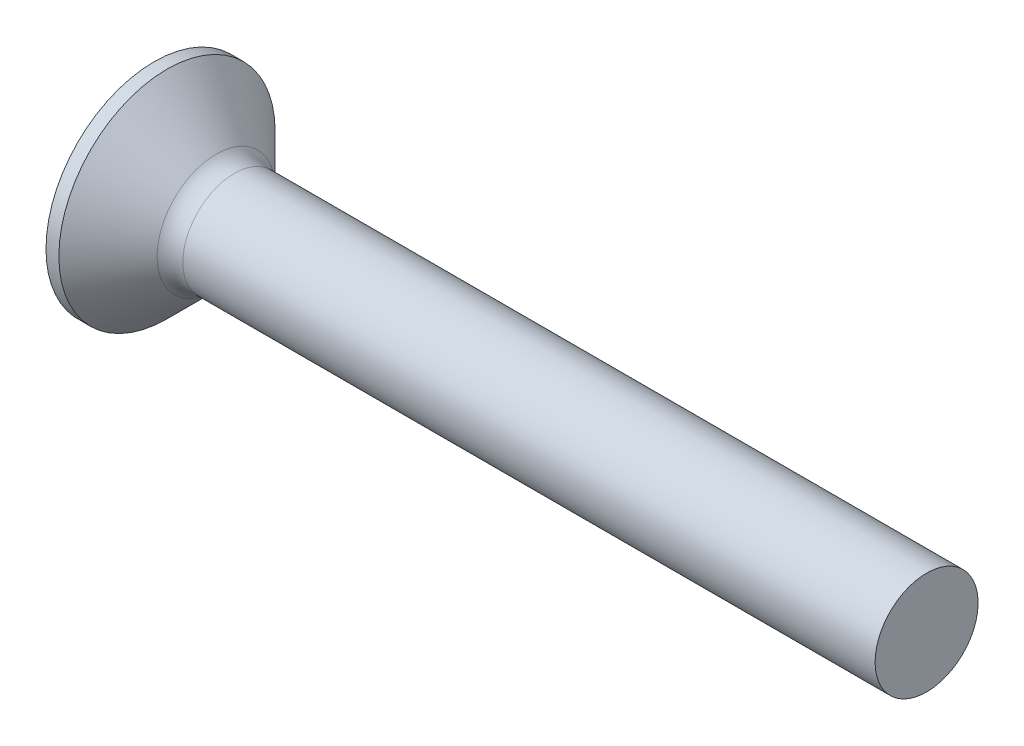
ISO-10303-21;
HEADER;
FILE_DESCRIPTION(('STEP AP214'),'2;1');
FILE_NAME('part.step','',(''),(''),'','','');
FILE_SCHEMA(('AUTOMOTIVE_DESIGN { 1 0 10303 214 1 1 1 1 }'));
ENDSEC;
DATA;
#1=APPLICATION_CONTEXT('core data for automotive mechanical design processes');
#2=APPLICATION_PROTOCOL_DEFINITION('international standard','automotive_design',2000,#1);
#3=PRODUCT_CONTEXT('',#1,'mechanical');
#4=PRODUCT('Part','Part','',(#3));
#5=PRODUCT_RELATED_PRODUCT_CATEGORY('part','',(#4));
#6=PRODUCT_DEFINITION_FORMATION('','',#4);
#7=PRODUCT_DEFINITION_CONTEXT('part definition',#1,'design');
#8=PRODUCT_DEFINITION('design','',#6,#7);
#9=PRODUCT_DEFINITION_SHAPE('','',#8);
#10=(LENGTH_UNIT() NAMED_UNIT(*) SI_UNIT(.MILLI.,.METRE.));
#11=(NAMED_UNIT(*) PLANE_ANGLE_UNIT() SI_UNIT($,.RADIAN.));
#12=(NAMED_UNIT(*) SI_UNIT($,.STERADIAN.) SOLID_ANGLE_UNIT());
#13=UNCERTAINTY_MEASURE_WITH_UNIT(LENGTH_MEASURE(1.E-05),#10,'distance_accuracy_value','');
#14=(GEOMETRIC_REPRESENTATION_CONTEXT(3) GLOBAL_UNCERTAINTY_ASSIGNED_CONTEXT((#13)) GLOBAL_UNIT_ASSIGNED_CONTEXT((#10,
#11,#12)) REPRESENTATION_CONTEXT('',''));
#15=CARTESIAN_POINT('',(0.,0.,0.));
#16=DIRECTION('',(0.,0.,1.));
#17=DIRECTION('',(1.,0.,0.));
#18=AXIS2_PLACEMENT_3D('',#15,#16,#17);
#19=CARTESIAN_POINT('',(9.32000000000001,0.,0.));
#20=DIRECTION('',(-1.,0.,0.));
#21=DIRECTION('',(0.,-1.,0.));
#22=AXIS2_PLACEMENT_3D('',#19,#20,#21);
#23=SPHERICAL_SURFACE('',#22,9.32000000000001);
#24=CARTESIAN_POINT('',(1.,0.,0.));
#25=DIRECTION('',(-1.,0.,0.));
#26=DIRECTION('',(0.,0.,1.));
#27=AXIS2_PLACEMENT_3D('',#24,#25,#26);
#28=CIRCLE('',#27,4.2);
#29=CARTESIAN_POINT('',(1.,0.,4.2));
#30=VERTEX_POINT('',#29);
#31=EDGE_CURVE('E211',#30,#30,#28,.T.);
#32=ORIENTED_EDGE('',*,*,#31,.T.);
#33=EDGE_LOOP('',(#32));
#34=FACE_BOUND('',#33,.T.);
#35=CARTESIAN_POINT('',(9.32000000000001,0.515,0.));
#36=DIRECTION('',(0.,-1.,0.));
#37=DIRECTION('',(0.,0.,-1.));
#38=AXIS2_PLACEMENT_3D('',#35,#36,#37);
#39=CIRCLE('',#38,9.3057603128385);
#40=CARTESIAN_POINT('',(0.31412764238453,0.515000000000008,-2.34338176111737));
#41=VERTEX_POINT('',#40);
#42=CARTESIAN_POINT('',(0.0608783606675722,0.515000000000003,-0.930506027947122));
#43=VERTEX_POINT('',#42);
#44=EDGE_CURVE('E292',#41,#43,#39,.F.);
#45=ORIENTED_EDGE('',*,*,#44,.T.);
#46=CARTESIAN_POINT('',(0.0608783606675708,0.,0.));
#47=DIRECTION('',(1.,0.,0.));
#48=DIRECTION('',(0.,0.,-1.));
#49=AXIS2_PLACEMENT_3D('',#46,#47,#48);
#50=CIRCLE('',#49,1.06351608734703);
#51=CARTESIAN_POINT('',(0.0608783606675708,0.930506027947123,-0.515));
#52=VERTEX_POINT('',#51);
#53=EDGE_CURVE('E321',#43,#52,#50,.T.);
#54=ORIENTED_EDGE('',*,*,#53,.T.);
#55=CARTESIAN_POINT('',(9.32000000000001,0.,-0.515));
#56=DIRECTION('',(0.,0.,1.));
#57=DIRECTION('',(1.,0.,0.));
#58=AXIS2_PLACEMENT_3D('',#55,#56,#57);
#59=CIRCLE('',#58,9.3057603128385);
#60=CARTESIAN_POINT('',(0.314127642384539,2.3433817611174,-0.515));
#61=VERTEX_POINT('',#60);
#62=EDGE_CURVE('E233',#52,#61,#59,.F.);
#63=ORIENTED_EDGE('',*,*,#62,.T.);
#64=CARTESIAN_POINT('',(8.4627527920284,-1.71937218999577,0.));
#65=DIRECTION('',(0.446197753347395,0.894934391398463,0.));
#66=DIRECTION('',(-0.894934391398463,0.446197753347395,0.));
#67=AXIS2_PLACEMENT_3D('',#64,#65,#66);
#68=CIRCLE('',#67,9.11982930194936);
#69=CARTESIAN_POINT('',(0.314127642384539,2.34338176111741,0.515));
#70=VERTEX_POINT('',#69);
#71=EDGE_CURVE('E237',#70,#61,#68,.F.);
#72=ORIENTED_EDGE('',*,*,#71,.F.);
#73=CARTESIAN_POINT('',(9.32000000000001,0.,0.515));
#74=DIRECTION('',(0.,0.,-1.));
#75=DIRECTION('',(0.,1.,0.));
#76=AXIS2_PLACEMENT_3D('',#73,#74,#75);
#77=CIRCLE('',#76,9.3057603128385);
#78=CARTESIAN_POINT('',(0.0608783606675708,0.930506027947123,0.515));
#79=VERTEX_POINT('',#78);
#80=EDGE_CURVE('E230',#70,#79,#77,.F.);
#81=ORIENTED_EDGE('',*,*,#80,.T.);
#82=CARTESIAN_POINT('',(0.0608783606675726,0.514999999999997,0.930506027947125));
#83=VERTEX_POINT('',#82);
#84=EDGE_CURVE('E347',#79,#83,#50,.T.);
#85=ORIENTED_EDGE('',*,*,#84,.T.);
#86=CARTESIAN_POINT('',(0.314127642384539,0.514999999999992,2.34338176111741));
#87=VERTEX_POINT('',#86);
#88=EDGE_CURVE('E258',#83,#87,#39,.F.);
#89=ORIENTED_EDGE('',*,*,#88,.T.);
#90=CARTESIAN_POINT('',(8.4627527920284,0.,-1.71937218999577));
#91=DIRECTION('',(0.446197753347395,0.,0.894934391398463));
#92=DIRECTION('',(0.894934391398463,0.,-0.446197753347395));
#93=AXIS2_PLACEMENT_3D('',#90,#91,#92);
#94=CIRCLE('',#93,9.11982930194936);
#95=CARTESIAN_POINT('',(0.314127642384539,-0.515000000000009,2.3433817611174));
#96=VERTEX_POINT('',#95);
#97=EDGE_CURVE('E55',#96,#87,#94,.F.);
#98=ORIENTED_EDGE('',*,*,#97,.F.);
#99=CARTESIAN_POINT('',(9.32000000000001,-0.515,0.));
#100=DIRECTION('',(0.,1.,0.));
#101=DIRECTION('',(0.,0.,1.));
#102=AXIS2_PLACEMENT_3D('',#99,#100,#101);
#103=CIRCLE('',#102,9.3057603128385);
#104=CARTESIAN_POINT('',(0.0608783606675712,-0.515000000000003,0.930506027947122));
#105=VERTEX_POINT('',#104);
#106=EDGE_CURVE('E261',#96,#105,#103,.F.);
#107=ORIENTED_EDGE('',*,*,#106,.T.);
#108=CARTESIAN_POINT('',(0.0608783606675708,-0.930506027947123,0.515));
#109=VERTEX_POINT('',#108);
#110=EDGE_CURVE('E382',#105,#109,#50,.T.);
#111=ORIENTED_EDGE('',*,*,#110,.T.);
#112=CARTESIAN_POINT('',(0.31412764238453,-2.34338176111737,0.514999999999999));
#113=VERTEX_POINT('',#112);
#114=EDGE_CURVE('E229',#109,#113,#77,.F.);
#115=ORIENTED_EDGE('',*,*,#114,.T.);
#116=CARTESIAN_POINT('',(8.46275279202785,1.71937218999647,0.));
#117=DIRECTION('',(0.446197753347477,-0.894934391398422,0.));
#118=DIRECTION('',(0.894934391398422,0.446197753347477,0.));
#119=AXIS2_PLACEMENT_3D('',#116,#117,#118);
#120=CIRCLE('',#119,9.11982930194918);
#121=CARTESIAN_POINT('',(0.31412764238453,-2.34338176111737,-0.515));
#122=VERTEX_POINT('',#121);
#123=EDGE_CURVE('E227',#122,#113,#120,.F.);
#124=ORIENTED_EDGE('',*,*,#123,.F.);
#125=CARTESIAN_POINT('',(0.0608783606675708,-0.930506027947123,-0.515));
#126=VERTEX_POINT('',#125);
#127=EDGE_CURVE('E234',#122,#126,#59,.F.);
#128=ORIENTED_EDGE('',*,*,#127,.T.);
#129=CARTESIAN_POINT('',(0.0608783606675709,-0.514999999999996,-0.930506027947126));
#130=VERTEX_POINT('',#129);
#131=EDGE_CURVE('E342',#126,#130,#50,.T.);
#132=ORIENTED_EDGE('',*,*,#131,.T.);
#133=CARTESIAN_POINT('',(0.31412764238453,-0.514999999999991,-2.34338176111737));
#134=VERTEX_POINT('',#133);
#135=EDGE_CURVE('E263',#130,#134,#103,.F.);
#136=ORIENTED_EDGE('',*,*,#135,.T.);
#137=CARTESIAN_POINT('',(8.46275279202785,0.,1.71937218999647));
#138=DIRECTION('',(0.446197753347477,0.,-0.894934391398422));
#139=DIRECTION('',(-0.894934391398422,0.,-0.446197753347477));
#140=AXIS2_PLACEMENT_3D('',#137,#138,#139);
#141=CIRCLE('',#140,9.11982930194918);
#142=EDGE_CURVE('E240',#41,#134,#141,.F.);
#143=ORIENTED_EDGE('',*,*,#142,.F.);
#144=EDGE_LOOP('',(#45,#54,#63,#72,#81,#85,#89,#98,#107,#111,#115,#124,#128,#132,#136,#143));
#145=FACE_BOUND('',#144,.T.);
#146=ADVANCED_FACE('F41',(#34,#145),#23,.T.);
#147=CARTESIAN_POINT('',(3.1,0.954397273508,-0.515));
#148=DIRECTION('',(0.,0.,1.));
#149=DIRECTION('',(1.,0.,0.));
#150=AXIS2_PLACEMENT_3D('',#147,#148,#149);
#151=PLANE('',#150);
#152=ORIENTED_EDGE('',*,*,#62,.F.);
#153=CARTESIAN_POINT('',(-1.51350935868061,1.05457609529703,-0.515));
#154=CARTESIAN_POINT('',(-1.19095756898956,1.02946929695738,-0.515));
#155=CARTESIAN_POINT('',(-0.868418100655429,1.00420218778782,-0.515));
#156=CARTESIAN_POINT('',(-0.223370410701535,0.953235962920824,-0.515));
#157=CARTESIAN_POINT('',(0.0991378106119195,0.927536843349418,-0.515));
#158=CARTESIAN_POINT('',(0.744110602564964,0.875595660283787,-0.515));
#159=CARTESIAN_POINT('',(1.06657517320614,0.849353596809247,-0.515));
#160=CARTESIAN_POINT('',(1.71144366881838,0.796155443949035,-0.515));
#161=CARTESIAN_POINT('',(2.03384759413785,0.769199358799847,-0.515));
#162=CARTESIAN_POINT('',(2.59585161484893,0.721356774291739,-0.515));
#163=CARTESIAN_POINT('',(2.83547018368547,0.700687775889178,-0.515));
#164=CARTESIAN_POINT('',(3.31464494543874,0.658646734801249,-0.515));
#165=CARTESIAN_POINT('',(3.55420113855084,0.637274694345303,-0.515));
#166=CARTESIAN_POINT('',(4.0332358507464,0.593604611178465,-0.515));
#167=CARTESIAN_POINT('',(4.27271436777158,0.571306545674765,-0.515));
#168=CARTESIAN_POINT('',(4.75154290591158,0.525345817751328,-0.515));
#169=CARTESIAN_POINT('',(4.99089292544568,0.501683138916145,-0.515));
#170=CARTESIAN_POINT('',(5.23015335451577,0.477118870369912,-0.515));
#171=B_SPLINE_CURVE_WITH_KNOTS('',3,(#153,#154,#155,#156,#157,#158,#159,#160,#161,#162,#163,
#164,#165,#166,#167,#168,#169,#170),.UNSPECIFIED.,.F.,.F.,(4,2,2,2,2,2,2,2,4),(0.,
0.970582535235106,1.94117377862305,2.91176498682315,3.88235043753319,4.60387465387786,
5.32539658241397,6.04693628073922,6.76848466054722),.UNSPECIFIED.);
#172=CARTESIAN_POINT('',(3.1,0.677477674908922,-0.514999999999999));
#173=VERTEX_POINT('',#172);
#174=EDGE_CURVE('E369',#52,#173,#171,.T.);
#175=ORIENTED_EDGE('',*,*,#174,.T.);
#176=DIRECTION('',(0.,1.,0.));
#177=VECTOR('',#176,1.);
#178=CARTESIAN_POINT('',(3.1,-0.954397273507643,-0.515));
#179=LINE('',#178,#177);
#180=CARTESIAN_POINT('',(3.1,0.954397273508,-0.515));
#181=VERTEX_POINT('',#180);
#182=EDGE_CURVE('E312',#173,#181,#179,.T.);
#183=ORIENTED_EDGE('',*,*,#182,.T.);
#184=DIRECTION('',(0.894934391398463,-0.446197753347395,0.));
#185=VECTOR('',#184,1.);
#186=CARTESIAN_POINT('',(0.,2.5,-0.515));
#187=LINE('',#186,#185);
#188=EDGE_CURVE('E208',#61,#181,#187,.T.);
#189=ORIENTED_EDGE('',*,*,#188,.F.);
#190=EDGE_LOOP('',(#152,#175,#183,#189));
#191=FACE_BOUND('',#190,.T.);
#192=ADVANCED_FACE('F176',(#191),#151,.T.);
#193=CARTESIAN_POINT('',(3.1,-0.954397273507643,-0.515));
#194=VERTEX_POINT('',#193);
#195=CARTESIAN_POINT('',(3.1,-0.677477674908922,-0.514999999999999));
#196=VERTEX_POINT('',#195);
#197=EDGE_CURVE('E217',#194,#196,#179,.T.);
#198=ORIENTED_EDGE('',*,*,#197,.T.);
#199=CARTESIAN_POINT('',(-1.51350935868061,-1.05457609529703,-0.515));
#200=CARTESIAN_POINT('',(-1.19095756898956,-1.02946929695738,-0.515));
#201=CARTESIAN_POINT('',(-0.868418100655429,-1.00420218778782,-0.515));
#202=CARTESIAN_POINT('',(-0.223370410701535,-0.953235962920824,-0.515));
#203=CARTESIAN_POINT('',(0.0991378106119193,-0.927536843349418,-0.515));
#204=CARTESIAN_POINT('',(0.744110602564964,-0.875595660283787,-0.515));
#205=CARTESIAN_POINT('',(1.06657517320614,-0.849353596809247,-0.515));
#206=CARTESIAN_POINT('',(1.71144366881838,-0.796155443949035,-0.515));
#207=CARTESIAN_POINT('',(2.03384759413785,-0.769199358799847,-0.515));
#208=CARTESIAN_POINT('',(2.59585161484893,-0.721356774291739,-0.515));
#209=CARTESIAN_POINT('',(2.83547018368547,-0.700687775889178,-0.515));
#210=CARTESIAN_POINT('',(3.31464494543874,-0.658646734801249,-0.515));
#211=CARTESIAN_POINT('',(3.55420113855084,-0.637274694345303,-0.515));
#212=CARTESIAN_POINT('',(4.0332358507464,-0.593604611178465,-0.515));
#213=CARTESIAN_POINT('',(4.27271436777159,-0.571306545674765,-0.515));
#214=CARTESIAN_POINT('',(4.75154290591158,-0.525345817751327,-0.515));
#215=CARTESIAN_POINT('',(4.99089292544568,-0.501683138916145,-0.515));
#216=CARTESIAN_POINT('',(5.23015335451577,-0.477118870369912,-0.515));
#217=B_SPLINE_CURVE_WITH_KNOTS('',3,(#199,#200,#201,#202,#203,#204,#205,#206,#207,#208,#209,
#210,#211,#212,#213,#214,#215,#216),.UNSPECIFIED.,.F.,.F.,(4,2,2,2,2,2,2,2,4),(0.,
0.970582535235105,1.94117377862305,2.91176498682315,3.88235043753319,4.60387465387786,
5.32539658241397,6.04693628073923,6.76848466054722),.UNSPECIFIED.);
#218=EDGE_CURVE('E346',#196,#126,#217,.F.);
#219=ORIENTED_EDGE('',*,*,#218,.T.);
#220=ORIENTED_EDGE('',*,*,#127,.F.);
#221=DIRECTION('',(0.894934391398422,0.446197753347477,0.));
#222=VECTOR('',#221,1.);
#223=CARTESIAN_POINT('',(0.,-2.5,-0.515));
#224=LINE('',#223,#222);
#225=EDGE_CURVE('E70',#122,#194,#224,.T.);
#226=ORIENTED_EDGE('',*,*,#225,.T.);
#227=EDGE_LOOP('',(#198,#219,#220,#226));
#228=FACE_BOUND('',#227,.T.);
#229=ADVANCED_FACE('F182',(#228),#151,.T.);
#230=CARTESIAN_POINT('',(3.1,-0.954397273507643,0.515));
#231=DIRECTION('',(0.,0.,-1.));
#232=DIRECTION('',(0.,1.,0.));
#233=AXIS2_PLACEMENT_3D('',#230,#231,#232);
#234=PLANE('',#233);
#235=DIRECTION('',(0.,-1.,0.));
#236=VECTOR('',#235,1.);
#237=CARTESIAN_POINT('',(3.1,0.954397273508,0.515));
#238=LINE('',#237,#236);
#239=CARTESIAN_POINT('',(3.1,0.954397273508,0.515));
#240=VERTEX_POINT('',#239);
#241=CARTESIAN_POINT('',(3.1,0.677477674908922,0.514999999999999));
#242=VERTEX_POINT('',#241);
#243=EDGE_CURVE('E302',#240,#242,#238,.T.);
#244=ORIENTED_EDGE('',*,*,#243,.T.);
#245=CARTESIAN_POINT('',(-1.51350936111664,1.0545760954866,0.515));
#246=CARTESIAN_POINT('',(-1.19095757112503,1.02946929712442,0.515));
#247=CARTESIAN_POINT('',(-0.868418102490364,1.00420218793212,0.515));
#248=CARTESIAN_POINT('',(-0.223370411935421,0.953235963019012,0.515));
#249=CARTESIAN_POINT('',(0.09913780967854,0.927536843424223,0.515));
#250=CARTESIAN_POINT('',(0.744110602455237,0.875595660292984,0.515));
#251=CARTESIAN_POINT('',(1.06657517361953,0.849353596775842,0.515));
#252=CARTESIAN_POINT('',(1.71144367027778,0.796155443827942,0.515));
#253=CARTESIAN_POINT('',(2.03384759612015,0.769199358633667,0.515));
#254=CARTESIAN_POINT('',(2.59585161735382,0.721356774076593,0.515));
#255=CARTESIAN_POINT('',(2.83547018619018,0.70068777567191,0.515));
#256=CARTESIAN_POINT('',(3.31464494794304,0.658646734579058,0.515));
#257=CARTESIAN_POINT('',(3.5542011410549,0.637274694120309,0.515));
#258=CARTESIAN_POINT('',(4.0332358532499,0.593604610946871,0.515));
#259=CARTESIAN_POINT('',(4.27271437027475,0.571306545439374,0.515));
#260=CARTESIAN_POINT('',(4.7515429084139,0.525345817506525,0.515));
#261=CARTESIAN_POINT('',(4.99089292794747,0.50168313866573,0.515));
#262=CARTESIAN_POINT('',(5.23015335701689,0.477118870112566,0.515));
#263=B_SPLINE_CURVE_WITH_KNOTS('',3,(#245,#246,#247,#248,#249,#250,#251,#252,#253,#254,#255,
#256,#257,#258,#259,#260,#261,#262),.UNSPECIFIED.,.F.,.F.,(4,2,2,2,2,2,2,2,4),(0.,
0.970582536139303,1.94117378043149,2.91176499020614,3.88235044249068,4.60387465883538,
5.32539658737152,6.04693628569685,6.76848466550493),.UNSPECIFIED.);
#264=EDGE_CURVE('E268',#242,#79,#263,.F.);
#265=ORIENTED_EDGE('',*,*,#264,.T.);
#266=ORIENTED_EDGE('',*,*,#80,.F.);
#267=DIRECTION('',(0.894934391398463,-0.446197753347395,0.));
#268=VECTOR('',#267,1.);
#269=CARTESIAN_POINT('',(0.,2.5,0.515));
#270=LINE('',#269,#268);
#271=EDGE_CURVE('E214',#70,#240,#270,.T.);
#272=ORIENTED_EDGE('',*,*,#271,.T.);
#273=EDGE_LOOP('',(#244,#265,#266,#272));
#274=FACE_BOUND('',#273,.T.);
#275=ADVANCED_FACE('F365',(#274),#234,.T.);
#276=ORIENTED_EDGE('',*,*,#114,.F.);
#277=CARTESIAN_POINT('',(-1.51350936111664,-1.0545760954866,0.515));
#278=CARTESIAN_POINT('',(-1.19095757112503,-1.02946929712442,0.515));
#279=CARTESIAN_POINT('',(-0.868418102490364,-1.00420218793212,0.515));
#280=CARTESIAN_POINT('',(-0.223370411935421,-0.953235963019012,0.515));
#281=CARTESIAN_POINT('',(0.0991378096785398,-0.927536843424223,0.515));
#282=CARTESIAN_POINT('',(0.744110602455238,-0.875595660292984,0.515));
#283=CARTESIAN_POINT('',(1.06657517361953,-0.849353596775842,0.515));
#284=CARTESIAN_POINT('',(1.71144367027778,-0.796155443827942,0.515));
#285=CARTESIAN_POINT('',(2.03384759612015,-0.769199358633667,0.515));
#286=CARTESIAN_POINT('',(2.59585161735382,-0.721356774076593,0.515));
#287=CARTESIAN_POINT('',(2.83547018619018,-0.70068777567191,0.515));
#288=CARTESIAN_POINT('',(3.31464494794304,-0.658646734579058,0.515));
#289=CARTESIAN_POINT('',(3.5542011410549,-0.637274694120309,0.515));
#290=CARTESIAN_POINT('',(4.03323585324989,-0.593604610946872,0.515));
#291=CARTESIAN_POINT('',(4.27271437027475,-0.571306545439374,0.515));
#292=CARTESIAN_POINT('',(4.7515429084139,-0.525345817506526,0.515));
#293=CARTESIAN_POINT('',(4.99089292794747,-0.50168313866573,0.515));
#294=CARTESIAN_POINT('',(5.23015335701689,-0.477118870112566,0.515));
#295=B_SPLINE_CURVE_WITH_KNOTS('',3,(#277,#278,#279,#280,#281,#282,#283,#284,#285,#286,#287,
#288,#289,#290,#291,#292,#293,#294),.UNSPECIFIED.,.F.,.F.,(4,2,2,2,2,2,2,2,4),(0.,
0.970582536139303,1.94117378043149,2.91176499020614,3.88235044249068,4.60387465883538,
5.32539658737152,6.04693628569685,6.76848466550493),.UNSPECIFIED.);
#296=CARTESIAN_POINT('',(3.1,-0.677477674908923,0.514999999999999));
#297=VERTEX_POINT('',#296);
#298=EDGE_CURVE('E383',#109,#297,#295,.T.);
#299=ORIENTED_EDGE('',*,*,#298,.T.);
#300=CARTESIAN_POINT('',(3.1,-0.954397273507643,0.515));
#301=VERTEX_POINT('',#300);
#302=EDGE_CURVE('E304',#297,#301,#238,.T.);
#303=ORIENTED_EDGE('',*,*,#302,.T.);
#304=DIRECTION('',(0.894934391398422,0.446197753347477,0.));
#305=VECTOR('',#304,1.);
#306=CARTESIAN_POINT('',(0.,-2.5,0.515));
#307=LINE('',#306,#305);
#308=EDGE_CURVE('E296',#113,#301,#307,.T.);
#309=ORIENTED_EDGE('',*,*,#308,.F.);
#310=EDGE_LOOP('',(#276,#299,#303,#309));
#311=FACE_BOUND('',#310,.T.);
#312=ADVANCED_FACE('F493',(#311),#234,.T.);
#313=CARTESIAN_POINT('',(3.1,0.954397273508,-0.515));
#314=DIRECTION('',(-1.,0.,0.));
#315=DIRECTION('',(0.,0.,1.));
#316=AXIS2_PLACEMENT_3D('',#313,#314,#315);
#317=PLANE('',#316);
#318=ORIENTED_EDGE('',*,*,#302,.F.);
#319=CARTESIAN_POINT('',(3.1,0.,0.));
#320=DIRECTION('',(-1.,0.,0.));
#321=DIRECTION('',(0.,0.,1.));
#322=AXIS2_PLACEMENT_3D('',#319,#320,#321);
#323=CIRCLE('',#322,0.850999999999999);
#324=EDGE_CURVE('E339',#196,#297,#323,.T.);
#325=ORIENTED_EDGE('',*,*,#324,.F.);
#326=ORIENTED_EDGE('',*,*,#197,.F.);
#327=DIRECTION('',(0.,0.,1.));
#328=VECTOR('',#327,1.);
#329=CARTESIAN_POINT('',(3.1,-0.954397273507643,-0.515));
#330=LINE('',#329,#328);
#331=EDGE_CURVE('E299',#194,#301,#330,.T.);
#332=ORIENTED_EDGE('',*,*,#331,.T.);
#333=EDGE_LOOP('',(#318,#325,#326,#332));
#334=FACE_BOUND('',#333,.T.);
#335=ADVANCED_FACE('F413',(#334),#317,.T.);
#336=DIRECTION('',(0.,0.,-1.));
#337=VECTOR('',#336,1.);
#338=CARTESIAN_POINT('',(3.1,-0.515000000000004,0.954397273507998));
#339=LINE('',#338,#337);
#340=CARTESIAN_POINT('',(3.1,-0.514999999999998,-0.677477674908925));
#341=VERTEX_POINT('',#340);
#342=CARTESIAN_POINT('',(3.1,-0.514999999999997,-0.954397273507645));
#343=VERTEX_POINT('',#342);
#344=EDGE_CURVE('E286',#341,#343,#339,.T.);
#345=ORIENTED_EDGE('',*,*,#344,.F.);
#346=CARTESIAN_POINT('',(3.1,0.515000000000002,-0.67747767490892));
#347=VERTEX_POINT('',#346);
#348=EDGE_CURVE('E62',#347,#341,#323,.T.);
#349=ORIENTED_EDGE('',*,*,#348,.F.);
#350=DIRECTION('',(0.,0.,1.));
#351=VECTOR('',#350,1.);
#352=CARTESIAN_POINT('',(3.1,0.515000000000003,-0.954397273507641));
#353=LINE('',#352,#351);
#354=CARTESIAN_POINT('',(3.1,0.515000000000003,-0.954397273507641));
#355=VERTEX_POINT('',#354);
#356=EDGE_CURVE('E289',#355,#347,#353,.T.);
#357=ORIENTED_EDGE('',*,*,#356,.F.);
#358=DIRECTION('',(0.,-1.,0.));
#359=VECTOR('',#358,1.);
#360=CARTESIAN_POINT('',(3.1,0.515000000000003,-0.954397273507641));
#361=LINE('',#360,#359);
#362=EDGE_CURVE('E280',#355,#343,#361,.T.);
#363=ORIENTED_EDGE('',*,*,#362,.T.);
#364=EDGE_LOOP('',(#345,#349,#357,#363));
#365=FACE_BOUND('',#364,.T.);
#366=ADVANCED_FACE('F334',(#365),#317,.T.);
#367=ORIENTED_EDGE('',*,*,#182,.F.);
#368=EDGE_CURVE('E338',#242,#173,#323,.T.);
#369=ORIENTED_EDGE('',*,*,#368,.F.);
#370=ORIENTED_EDGE('',*,*,#243,.F.);
#371=DIRECTION('',(0.,0.,-1.));
#372=VECTOR('',#371,1.);
#373=CARTESIAN_POINT('',(3.1,0.954397273508,0.515));
#374=LINE('',#373,#372);
#375=EDGE_CURVE('E305',#240,#181,#374,.T.);
#376=ORIENTED_EDGE('',*,*,#375,.T.);
#377=EDGE_LOOP('',(#367,#369,#370,#376));
#378=FACE_BOUND('',#377,.T.);
#379=ADVANCED_FACE('F414',(#378),#317,.T.);
#380=CARTESIAN_POINT('',(3.1,0.514999999999997,0.954397273508002));
#381=DIRECTION('',(0.,-1.,0.));
#382=DIRECTION('',(1.,0.,0.));
#383=AXIS2_PLACEMENT_3D('',#380,#381,#382);
#384=PLANE('',#383);
#385=ORIENTED_EDGE('',*,*,#88,.F.);
#386=CARTESIAN_POINT('',(-1.51350936111664,0.514999999999996,1.0545760954866));
#387=CARTESIAN_POINT('',(-1.19095757112503,0.514999999999996,1.02946929712442));
#388=CARTESIAN_POINT('',(-0.868418102490363,0.514999999999996,1.00420218793213));
#389=CARTESIAN_POINT('',(-0.223370411935421,0.514999999999997,0.953235963019014));
#390=CARTESIAN_POINT('',(0.0991378096785403,0.514999999999997,0.927536843424225));
#391=CARTESIAN_POINT('',(0.744110602455238,0.514999999999997,0.875595660292986));
#392=CARTESIAN_POINT('',(1.06657517361953,0.514999999999997,0.849353596775844));
#393=CARTESIAN_POINT('',(1.71144367027778,0.514999999999997,0.796155443827943));
#394=CARTESIAN_POINT('',(2.03384759612015,0.514999999999997,0.769199358633669));
#395=CARTESIAN_POINT('',(2.59585161735382,0.514999999999998,0.721356774076595));
#396=CARTESIAN_POINT('',(2.83547018619018,0.514999999999998,0.700687775671912));
#397=CARTESIAN_POINT('',(3.31464494794304,0.514999999999998,0.65864673457906));
#398=CARTESIAN_POINT('',(3.5542011410549,0.514999999999998,0.637274694120311));
#399=CARTESIAN_POINT('',(4.0332358532499,0.514999999999998,0.593604610946873));
#400=CARTESIAN_POINT('',(4.27271437027475,0.514999999999998,0.571306545439375));
#401=CARTESIAN_POINT('',(4.7515429084139,0.514999999999998,0.525345817506527));
#402=CARTESIAN_POINT('',(4.99089292794747,0.514999999999998,0.501683138665732));
#403=CARTESIAN_POINT('',(5.23015335701689,0.514999999999998,0.477118870112568));
#404=B_SPLINE_CURVE_WITH_KNOTS('',3,(#386,#387,#388,#389,#390,#391,#392,#393,#394,#395,#396,
#397,#398,#399,#400,#401,#402,#403),.UNSPECIFIED.,.F.,.F.,(4,2,2,2,2,2,2,2,4),(0.,
0.970582536139304,1.94117378043149,2.91176499020614,3.88235044249068,4.60387465883538,
5.32539658737152,6.04693628569685,6.76848466550493),.UNSPECIFIED.);
#405=CARTESIAN_POINT('',(3.1,0.514999999999998,0.677477674908924));
#406=VERTEX_POINT('',#405);
#407=EDGE_CURVE('E625',#83,#406,#404,.T.);
#408=ORIENTED_EDGE('',*,*,#407,.T.);
#409=CARTESIAN_POINT('',(3.1,0.514999999999997,0.954397273508002));
#410=VERTEX_POINT('',#409);
#411=EDGE_CURVE('E260',#406,#410,#353,.T.);
#412=ORIENTED_EDGE('',*,*,#411,.T.);
#413=DIRECTION('',(0.894934391398463,0.,-0.446197753347395));
#414=VECTOR('',#413,1.);
#415=CARTESIAN_POINT('',(0.,0.514999999999991,2.5));
#416=LINE('',#415,#414);
#417=EDGE_CURVE('E250',#87,#410,#416,.T.);
#418=ORIENTED_EDGE('',*,*,#417,.F.);
#419=EDGE_LOOP('',(#385,#408,#412,#418));
#420=FACE_BOUND('',#419,.T.);
#421=ADVANCED_FACE('F256',(#420),#384,.T.);
#422=CARTESIAN_POINT('',(3.1,-0.514999999999997,-0.954397273507645));
#423=DIRECTION('',(0.,1.,0.));
#424=DIRECTION('',(0.,0.,1.));
#425=AXIS2_PLACEMENT_3D('',#422,#423,#424);
#426=PLANE('',#425);
#427=CARTESIAN_POINT('',(3.1,-0.515000000000004,0.954397273507998));
#428=VERTEX_POINT('',#427);
#429=CARTESIAN_POINT('',(3.1,-0.515000000000003,0.67747767490892));
#430=VERTEX_POINT('',#429);
#431=EDGE_CURVE('E283',#428,#430,#339,.T.);
#432=ORIENTED_EDGE('',*,*,#431,.T.);
#433=CARTESIAN_POINT('',(-1.51350936111664,-0.515000000000004,1.0545760954866));
#434=CARTESIAN_POINT('',(-1.19095757112503,-0.515000000000004,1.02946929712441));
#435=CARTESIAN_POINT('',(-0.868418102490364,-0.515000000000004,1.00420218793212));
#436=CARTESIAN_POINT('',(-0.223370411935421,-0.515000000000003,0.95323596301901));
#437=CARTESIAN_POINT('',(0.0991378096785397,-0.515000000000003,0.927536843424221));
#438=CARTESIAN_POINT('',(0.744110602455238,-0.515000000000003,0.875595660292982));
#439=CARTESIAN_POINT('',(1.06657517361953,-0.515000000000003,0.84935359677584));
#440=CARTESIAN_POINT('',(1.71144367027778,-0.515000000000003,0.79615544382794));
#441=CARTESIAN_POINT('',(2.03384759612015,-0.515000000000003,0.769199358633665));
#442=CARTESIAN_POINT('',(2.59585161735381,-0.515000000000003,0.721356774076591));
#443=CARTESIAN_POINT('',(2.83547018619018,-0.515000000000002,0.700687775671908));
#444=CARTESIAN_POINT('',(3.31464494794304,-0.515000000000002,0.658646734579056));
#445=CARTESIAN_POINT('',(3.5542011410549,-0.515000000000002,0.637274694120307));
#446=CARTESIAN_POINT('',(4.03323585324989,-0.515000000000002,0.59360461094687));
#447=CARTESIAN_POINT('',(4.27271437027475,-0.515000000000002,0.571306545439372));
#448=CARTESIAN_POINT('',(4.7515429084139,-0.515000000000002,0.525345817506524));
#449=CARTESIAN_POINT('',(4.99089292794747,-0.515000000000002,0.501683138665728));
#450=CARTESIAN_POINT('',(5.23015335701689,-0.515000000000002,0.477118870112564));
#451=B_SPLINE_CURVE_WITH_KNOTS('',3,(#433,#434,#435,#436,#437,#438,#439,#440,#441,#442,#443,
#444,#445,#446,#447,#448,#449,#450),.UNSPECIFIED.,.F.,.F.,(4,2,2,2,2,2,2,2,4),(0.,
0.970582536139303,1.94117378043149,2.91176499020614,3.88235044249068,4.60387465883538,
5.32539658737152,6.04693628569685,6.76848466550493),.UNSPECIFIED.);
#452=EDGE_CURVE('E375',#430,#105,#451,.F.);
#453=ORIENTED_EDGE('',*,*,#452,.T.);
#454=ORIENTED_EDGE('',*,*,#106,.F.);
#455=DIRECTION('',(0.894934391398463,0.,-0.446197753347395));
#456=VECTOR('',#455,1.);
#457=CARTESIAN_POINT('',(0.,-0.515000000000009,2.5));
#458=LINE('',#457,#456);
#459=EDGE_CURVE('E252',#96,#428,#458,.T.);
#460=ORIENTED_EDGE('',*,*,#459,.T.);
#461=EDGE_LOOP('',(#432,#453,#454,#460));
#462=FACE_BOUND('',#461,.T.);
#463=ADVANCED_FACE('F202',(#462),#426,.T.);
#464=ORIENTED_EDGE('',*,*,#356,.T.);
#465=CARTESIAN_POINT('',(-1.51350936111664,0.515000000000004,-1.0545760954866));
#466=CARTESIAN_POINT('',(-1.19095757112503,0.515000000000004,-1.02946929712441));
#467=CARTESIAN_POINT('',(-0.868418102490364,0.515000000000004,-1.00420218793212));
#468=CARTESIAN_POINT('',(-0.223370411935421,0.515000000000003,-0.95323596301901));
#469=CARTESIAN_POINT('',(0.0991378096785398,0.515000000000003,-0.927536843424221));
#470=CARTESIAN_POINT('',(0.744110602455238,0.515000000000003,-0.875595660292982));
#471=CARTESIAN_POINT('',(1.06657517361953,0.515000000000003,-0.84935359677584));
#472=CARTESIAN_POINT('',(1.71144367027778,0.515000000000003,-0.79615544382794));
#473=CARTESIAN_POINT('',(2.03384759612015,0.515000000000003,-0.769199358633665));
#474=CARTESIAN_POINT('',(2.59585161735381,0.515000000000003,-0.721356774076591));
#475=CARTESIAN_POINT('',(2.83547018619018,0.515000000000003,-0.700687775671908));
#476=CARTESIAN_POINT('',(3.31464494794304,0.515000000000002,-0.658646734579056));
#477=CARTESIAN_POINT('',(3.5542011410549,0.515000000000002,-0.637274694120307));
#478=CARTESIAN_POINT('',(4.03323585324989,0.515000000000002,-0.59360461094687));
#479=CARTESIAN_POINT('',(4.27271437027475,0.515000000000002,-0.571306545439372));
#480=CARTESIAN_POINT('',(4.7515429084139,0.515000000000002,-0.525345817506524));
#481=CARTESIAN_POINT('',(4.99089292794747,0.515000000000002,-0.501683138665728));
#482=CARTESIAN_POINT('',(5.23015335701689,0.515000000000002,-0.477118870112564));
#483=B_SPLINE_CURVE_WITH_KNOTS('',3,(#465,#466,#467,#468,#469,#470,#471,#472,#473,#474,#475,
#476,#477,#478,#479,#480,#481,#482),.UNSPECIFIED.,.F.,.F.,(4,2,2,2,2,2,2,2,4),(0.,
0.970582536139303,1.94117378043149,2.91176499020614,3.88235044249068,4.60387465883538,
5.32539658737152,6.04693628569685,6.76848466550493),.UNSPECIFIED.);
#484=EDGE_CURVE('E327',#347,#43,#483,.F.);
#485=ORIENTED_EDGE('',*,*,#484,.T.);
#486=ORIENTED_EDGE('',*,*,#44,.F.);
#487=DIRECTION('',(0.894934391398422,0.,0.446197753347477));
#488=VECTOR('',#487,1.);
#489=CARTESIAN_POINT('',(0.,0.515000000000009,-2.5));
#490=LINE('',#489,#488);
#491=EDGE_CURVE('E265',#41,#355,#490,.T.);
#492=ORIENTED_EDGE('',*,*,#491,.T.);
#493=EDGE_LOOP('',(#464,#485,#486,#492));
#494=FACE_BOUND('',#493,.T.);
#495=ADVANCED_FACE('F200',(#494),#384,.T.);
#496=ORIENTED_EDGE('',*,*,#135,.F.);
#497=CARTESIAN_POINT('',(-1.51350936111664,-0.514999999999996,-1.0545760954866));
#498=CARTESIAN_POINT('',(-1.19095757112503,-0.514999999999996,-1.02946929712442));
#499=CARTESIAN_POINT('',(-0.868418102490363,-0.514999999999996,-1.00420218793213));
#500=CARTESIAN_POINT('',(-0.22337041193542,-0.514999999999996,-0.953235963019014));
#501=CARTESIAN_POINT('',(0.0991378096785402,-0.514999999999997,-0.927536843424225));
#502=CARTESIAN_POINT('',(0.744110602455238,-0.514999999999997,-0.875595660292986));
#503=CARTESIAN_POINT('',(1.06657517361953,-0.514999999999997,-0.849353596775844));
#504=CARTESIAN_POINT('',(1.71144367027778,-0.514999999999997,-0.796155443827944));
#505=CARTESIAN_POINT('',(2.03384759612015,-0.514999999999997,-0.769199358633669));
#506=CARTESIAN_POINT('',(2.59585161735382,-0.514999999999997,-0.721356774076595));
#507=CARTESIAN_POINT('',(2.83547018619018,-0.514999999999997,-0.700687775671912));
#508=CARTESIAN_POINT('',(3.31464494794304,-0.514999999999998,-0.65864673457906));
#509=CARTESIAN_POINT('',(3.5542011410549,-0.514999999999998,-0.637274694120311));
#510=CARTESIAN_POINT('',(4.0332358532499,-0.514999999999998,-0.593604610946873));
#511=CARTESIAN_POINT('',(4.27271437027475,-0.514999999999998,-0.571306545439375));
#512=CARTESIAN_POINT('',(4.7515429084139,-0.514999999999998,-0.525345817506527));
#513=CARTESIAN_POINT('',(4.99089292794747,-0.514999999999998,-0.501683138665732));
#514=CARTESIAN_POINT('',(5.23015335701689,-0.514999999999998,-0.477118870112568));
#515=B_SPLINE_CURVE_WITH_KNOTS('',3,(#497,#498,#499,#500,#501,#502,#503,#504,#505,#506,#507,
#508,#509,#510,#511,#512,#513,#514),.UNSPECIFIED.,.F.,.F.,(4,2,2,2,2,2,2,2,4),(0.,
0.970582536139303,1.94117378043149,2.91176499020614,3.88235044249068,4.60387465883538,
5.32539658737152,6.04693628569685,6.76848466550493),.UNSPECIFIED.);
#516=EDGE_CURVE('E11',#130,#341,#515,.T.);
#517=ORIENTED_EDGE('',*,*,#516,.T.);
#518=ORIENTED_EDGE('',*,*,#344,.T.);
#519=DIRECTION('',(0.894934391398422,0.,0.446197753347477));
#520=VECTOR('',#519,1.);
#521=CARTESIAN_POINT('',(0.,-0.514999999999991,-2.5));
#522=LINE('',#521,#520);
#523=EDGE_CURVE('E277',#134,#343,#522,.T.);
#524=ORIENTED_EDGE('',*,*,#523,.F.);
#525=EDGE_LOOP('',(#496,#517,#518,#524));
#526=FACE_BOUND('',#525,.T.);
#527=ADVANCED_FACE('F192',(#526),#426,.T.);
#528=CARTESIAN_POINT('',(31.,0.,0.));
#529=DIRECTION('',(-1.,0.,0.));
#530=DIRECTION('',(0.,0.,1.));
#531=AXIS2_PLACEMENT_3D('',#528,#529,#530);
#532=PLANE('',#531);
#533=CARTESIAN_POINT('',(31.,0.,0.));
#534=DIRECTION('',(-1.,0.,0.));
#535=DIRECTION('',(0.,0.,1.));
#536=AXIS2_PLACEMENT_3D('',#533,#534,#535);
#537=CIRCLE('',#536,2.);
#538=CARTESIAN_POINT('',(31.,0.,2.));
#539=VERTEX_POINT('',#538);
#540=EDGE_CURVE('E205',#539,#539,#537,.T.);
#541=ORIENTED_EDGE('',*,*,#540,.F.);
#542=EDGE_LOOP('',(#541));
#543=FACE_BOUND('',#542,.T.);
#544=ADVANCED_FACE('F190',(#543),#532,.F.);
#545=CARTESIAN_POINT('',(-15.875,0.,0.));
#546=DIRECTION('',(-1.,0.,0.));
#547=DIRECTION('',(0.,0.,1.));
#548=AXIS2_PLACEMENT_3D('',#545,#546,#547);
#549=CYLINDRICAL_SURFACE('',#548,4.2);
#550=ORIENTED_EDGE('',*,*,#31,.F.);
#551=EDGE_LOOP('',(#550));
#552=FACE_BOUND('',#551,.T.);
#553=CARTESIAN_POINT('',(1.50000000000001,0.,0.));
#554=DIRECTION('',(-1.,0.,0.));
#555=DIRECTION('',(0.,0.,1.));
#556=AXIS2_PLACEMENT_3D('',#553,#554,#555);
#557=CIRCLE('',#556,4.2);
#558=CARTESIAN_POINT('',(1.50000000000001,0.,4.2));
#559=VERTEX_POINT('',#558);
#560=EDGE_CURVE('E207',#559,#559,#557,.T.);
#561=ORIENTED_EDGE('',*,*,#560,.T.);
#562=EDGE_LOOP('',(#561));
#563=FACE_BOUND('',#562,.T.);
#564=ADVANCED_FACE('F188',(#552,#563),#549,.T.);
#565=CARTESIAN_POINT('',(1.50000000000001,0.,0.));
#566=DIRECTION('',(-1.,0.,0.));
#567=DIRECTION('',(0.,0.,1.));
#568=AXIS2_PLACEMENT_3D('',#565,#566,#567);
#569=CONICAL_SURFACE('',#568,4.2,0.78539816339745);
#570=CARTESIAN_POINT('',(3.40710678118655,0.,0.));
#571=DIRECTION('',(1.,0.,0.));
#572=DIRECTION('',(0.,0.,-1.));
#573=AXIS2_PLACEMENT_3D('',#570,#571,#572);
#574=CIRCLE('',#573,2.29289321881345);
#575=CARTESIAN_POINT('',(3.40710678118655,0.,-2.29289321881345));
#576=VERTEX_POINT('',#575);
#577=EDGE_CURVE('E221',#576,#576,#574,.F.);
#578=ORIENTED_EDGE('',*,*,#577,.T.);
#579=EDGE_LOOP('',(#578));
#580=FACE_BOUND('',#579,.T.);
#581=ORIENTED_EDGE('',*,*,#560,.F.);
#582=EDGE_LOOP('',(#581));
#583=FACE_BOUND('',#582,.T.);
#584=ADVANCED_FACE('F198',(#580,#583),#569,.T.);
#585=CARTESIAN_POINT('',(-15.875,0.,0.));
#586=DIRECTION('',(-1.,0.,0.));
#587=DIRECTION('',(0.,0.,1.));
#588=AXIS2_PLACEMENT_3D('',#585,#586,#587);
#589=CYLINDRICAL_SURFACE('',#588,2.);
#590=CARTESIAN_POINT('',(4.1142135623731,0.,0.));
#591=DIRECTION('',(-1.,0.,0.));
#592=DIRECTION('',(0.,0.,1.));
#593=AXIS2_PLACEMENT_3D('',#590,#591,#592);
#594=CIRCLE('',#593,2.);
#595=CARTESIAN_POINT('',(4.1142135623731,0.,2.));
#596=VERTEX_POINT('',#595);
#597=EDGE_CURVE('E224',#596,#596,#594,.F.);
#598=ORIENTED_EDGE('',*,*,#597,.T.);
#599=EDGE_LOOP('',(#598));
#600=FACE_BOUND('',#599,.T.);
#601=ORIENTED_EDGE('',*,*,#540,.T.);
#602=EDGE_LOOP('',(#601));
#603=FACE_BOUND('',#602,.T.);
#604=ADVANCED_FACE('F415',(#600,#603),#589,.T.);
#605=CARTESIAN_POINT('',(4.1142135623731,0.,0.));
#606=DIRECTION('',(-1.,0.,0.));
#607=DIRECTION('',(0.,0.,1.));
#608=AXIS2_PLACEMENT_3D('',#605,#606,#607);
#609=TOROIDAL_SURFACE('',#608,3.,1.);
#610=ORIENTED_EDGE('',*,*,#597,.F.);
#611=EDGE_LOOP('',(#610));
#612=FACE_BOUND('',#611,.T.);
#613=ORIENTED_EDGE('',*,*,#577,.F.);
#614=EDGE_LOOP('',(#613));
#615=FACE_BOUND('',#614,.T.);
#616=ADVANCED_FACE('F43',(#612,#615),#609,.F.);
#617=ORIENTED_EDGE('',*,*,#411,.F.);
#618=EDGE_CURVE('E343',#430,#406,#323,.T.);
#619=ORIENTED_EDGE('',*,*,#618,.F.);
#620=ORIENTED_EDGE('',*,*,#431,.F.);
#621=DIRECTION('',(0.,1.,0.));
#622=VECTOR('',#621,1.);
#623=CARTESIAN_POINT('',(3.1,-0.515000000000004,0.954397273507998));
#624=LINE('',#623,#622);
#625=EDGE_CURVE('E287',#428,#410,#624,.T.);
#626=ORIENTED_EDGE('',*,*,#625,.T.);
#627=EDGE_LOOP('',(#617,#619,#620,#626));
#628=FACE_BOUND('',#627,.T.);
#629=ADVANCED_FACE('F407',(#628),#317,.T.);
#630=CARTESIAN_POINT('',(3.1,0.954397273508,0.515));
#631=DIRECTION('',(0.446197753347395,0.894934391398463,0.));
#632=DIRECTION('',(-0.894934391398463,0.446197753347395,0.));
#633=AXIS2_PLACEMENT_3D('',#630,#631,#632);
#634=PLANE('',#633);
#635=ORIENTED_EDGE('',*,*,#71,.T.);
#636=ORIENTED_EDGE('',*,*,#188,.T.);
#637=ORIENTED_EDGE('',*,*,#375,.F.);
#638=ORIENTED_EDGE('',*,*,#271,.F.);
#639=EDGE_LOOP('',(#635,#636,#637,#638));
#640=FACE_BOUND('',#639,.T.);
#641=ADVANCED_FACE('F363',(#640),#634,.F.);
#642=CARTESIAN_POINT('',(0.,-2.5,-0.515));
#643=DIRECTION('',(0.446197753347477,-0.894934391398422,0.));
#644=DIRECTION('',(0.894934391398422,0.446197753347477,0.));
#645=AXIS2_PLACEMENT_3D('',#642,#643,#644);
#646=PLANE('',#645);
#647=ORIENTED_EDGE('',*,*,#123,.T.);
#648=ORIENTED_EDGE('',*,*,#308,.T.);
#649=ORIENTED_EDGE('',*,*,#331,.F.);
#650=ORIENTED_EDGE('',*,*,#225,.F.);
#651=EDGE_LOOP('',(#647,#648,#649,#650));
#652=FACE_BOUND('',#651,.T.);
#653=ADVANCED_FACE('F400',(#652),#646,.F.);
#654=CARTESIAN_POINT('',(3.1,-0.515000000000004,0.954397273507998));
#655=DIRECTION('',(0.446197753347395,0.,0.894934391398463));
#656=DIRECTION('',(-0.894934391398463,0.,0.446197753347395));
#657=AXIS2_PLACEMENT_3D('',#654,#655,#656);
#658=PLANE('',#657);
#659=ORIENTED_EDGE('',*,*,#97,.T.);
#660=ORIENTED_EDGE('',*,*,#417,.T.);
#661=ORIENTED_EDGE('',*,*,#625,.F.);
#662=ORIENTED_EDGE('',*,*,#459,.F.);
#663=EDGE_LOOP('',(#659,#660,#661,#662));
#664=FACE_BOUND('',#663,.T.);
#665=ADVANCED_FACE('F248',(#664),#658,.F.);
#666=CARTESIAN_POINT('',(0.,0.515000000000009,-2.5));
#667=DIRECTION('',(0.446197753347477,0.,-0.894934391398422));
#668=DIRECTION('',(0.894934391398422,0.,0.446197753347477));
#669=AXIS2_PLACEMENT_3D('',#666,#667,#668);
#670=PLANE('',#669);
#671=ORIENTED_EDGE('',*,*,#142,.T.);
#672=ORIENTED_EDGE('',*,*,#523,.T.);
#673=ORIENTED_EDGE('',*,*,#362,.F.);
#674=ORIENTED_EDGE('',*,*,#491,.F.);
#675=EDGE_LOOP('',(#671,#672,#673,#674));
#676=FACE_BOUND('',#675,.T.);
#677=ADVANCED_FACE('F329',(#676),#670,.F.);
#678=CARTESIAN_POINT('',(3.1,0.,0.));
#679=DIRECTION('',(-1.,0.,0.));
#680=DIRECTION('',(0.,0.,1.));
#681=AXIS2_PLACEMENT_3D('',#678,#679,#680);
#682=CONICAL_SURFACE('',#681,0.850999999999999,0.0698131700797659);
#683=EDGE_CURVE('E340',#406,#242,#323,.T.);
#684=ORIENTED_EDGE('',*,*,#683,.F.);
#685=ORIENTED_EDGE('',*,*,#407,.F.);
#686=ORIENTED_EDGE('',*,*,#84,.F.);
#687=ORIENTED_EDGE('',*,*,#264,.F.);
#688=EDGE_LOOP('',(#684,#685,#686,#687));
#689=FACE_BOUND('',#688,.T.);
#690=ADVANCED_FACE('F173',(#689),#682,.F.);
#691=ORIENTED_EDGE('',*,*,#110,.F.);
#692=ORIENTED_EDGE('',*,*,#452,.F.);
#693=EDGE_CURVE('E635',#297,#430,#323,.T.);
#694=ORIENTED_EDGE('',*,*,#693,.F.);
#695=ORIENTED_EDGE('',*,*,#298,.F.);
#696=EDGE_LOOP('',(#691,#692,#694,#695));
#697=FACE_BOUND('',#696,.T.);
#698=ADVANCED_FACE('F398',(#697),#682,.F.);
#699=ORIENTED_EDGE('',*,*,#53,.F.);
#700=ORIENTED_EDGE('',*,*,#484,.F.);
#701=EDGE_CURVE('E335',#173,#347,#323,.T.);
#702=ORIENTED_EDGE('',*,*,#701,.F.);
#703=ORIENTED_EDGE('',*,*,#174,.F.);
#704=EDGE_LOOP('',(#699,#700,#702,#703));
#705=FACE_BOUND('',#704,.T.);
#706=ADVANCED_FACE('F171',(#705),#682,.F.);
#707=EDGE_CURVE('E336',#341,#196,#323,.T.);
#708=ORIENTED_EDGE('',*,*,#707,.F.);
#709=ORIENTED_EDGE('',*,*,#516,.F.);
#710=ORIENTED_EDGE('',*,*,#131,.F.);
#711=ORIENTED_EDGE('',*,*,#218,.F.);
#712=EDGE_LOOP('',(#708,#709,#710,#711));
#713=FACE_BOUND('',#712,.T.);
#714=ADVANCED_FACE('F166',(#713),#682,.F.);
#715=CARTESIAN_POINT('',(3.3765066614942,0.,0.));
#716=DIRECTION('',(-1.,0.,0.));
#717=DIRECTION('',(0.,0.,1.));
#718=AXIS2_PLACEMENT_3D('',#715,#716,#717);
#719=CONICAL_SURFACE('',#718,0.,1.25663706143592);
#720=ORIENTED_EDGE('',*,*,#683,.T.);
#721=ORIENTED_EDGE('',*,*,#368,.T.);
#722=ORIENTED_EDGE('',*,*,#701,.T.);
#723=ORIENTED_EDGE('',*,*,#348,.T.);
#724=ORIENTED_EDGE('',*,*,#707,.T.);
#725=ORIENTED_EDGE('',*,*,#324,.T.);
#726=ORIENTED_EDGE('',*,*,#693,.T.);
#727=ORIENTED_EDGE('',*,*,#618,.T.);
#728=EDGE_LOOP('',(#720,#721,#722,#723,#724,#725,#726,#727));
#729=FACE_BOUND('',#728,.T.);
#730=CARTESIAN_POINT('',(3.3765066614942,0.,0.));
#731=VERTEX_POINT('',#730);
#732=VERTEX_LOOP('',#731);
#733=FACE_BOUND('',#732,.T.);
#734=ADVANCED_FACE('F164',(#729,#733),#719,.F.);
#735=CLOSED_SHELL('',(#146,#192,#229,#275,#312,#335,#366,#379,#421,#463,#495,#527,#544,#564,
#584,#604,#616,#629,#641,#653,#665,#677,#690,#698,#706,#714,#734));
#736=MANIFOLD_SOLID_BREP('B2',#735);
#737=ADVANCED_BREP_SHAPE_REPRESENTATION('',(#18,#736),#14);
#738=SHAPE_DEFINITION_REPRESENTATION(#9,#737);
ENDSEC;
END-ISO-10303-21;
